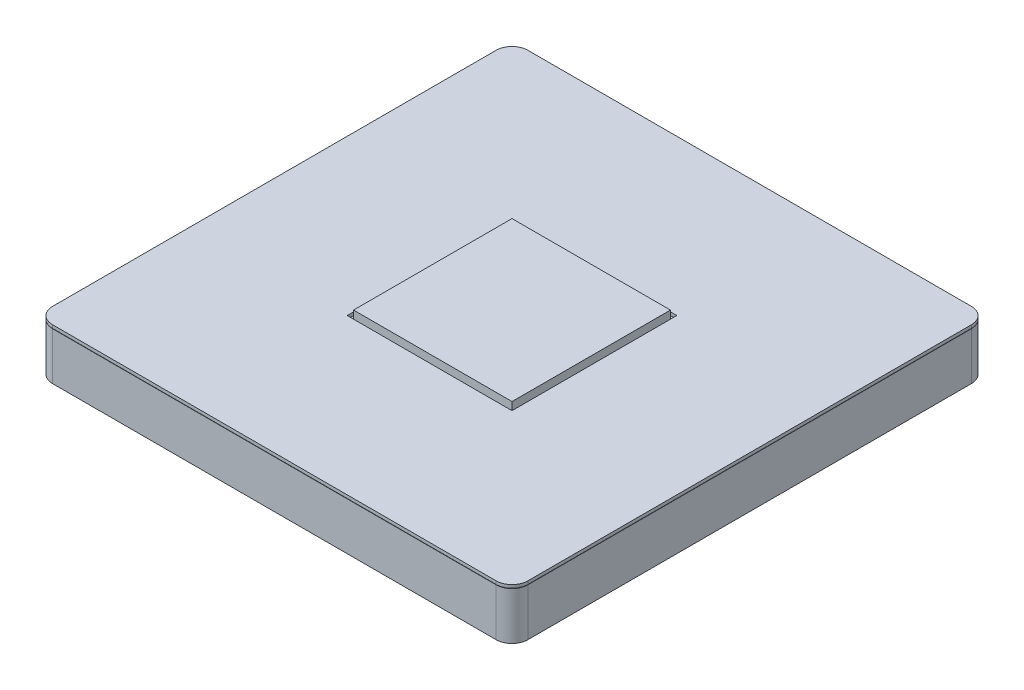
ISO-10303-21;
HEADER;
FILE_DESCRIPTION(('STEP AP214'),'2;1');
FILE_NAME('part.step','',(''),(''),'','','');
FILE_SCHEMA(('AUTOMOTIVE_DESIGN { 1 0 10303 214 1 1 1 1 }'));
ENDSEC;
DATA;
#1=APPLICATION_CONTEXT('core data for automotive mechanical design processes');
#2=APPLICATION_PROTOCOL_DEFINITION('international standard','automotive_design',2000,#1);
#3=PRODUCT_CONTEXT('',#1,'mechanical');
#4=PRODUCT('Part','Part','',(#3));
#5=PRODUCT_RELATED_PRODUCT_CATEGORY('part','',(#4));
#6=PRODUCT_DEFINITION_FORMATION('','',#4);
#7=PRODUCT_DEFINITION_CONTEXT('part definition',#1,'design');
#8=PRODUCT_DEFINITION('design','',#6,#7);
#9=PRODUCT_DEFINITION_SHAPE('','',#8);
#10=(LENGTH_UNIT() NAMED_UNIT(*) SI_UNIT(.MILLI.,.METRE.));
#11=(NAMED_UNIT(*) PLANE_ANGLE_UNIT() SI_UNIT($,.RADIAN.));
#12=(NAMED_UNIT(*) SI_UNIT($,.STERADIAN.) SOLID_ANGLE_UNIT());
#13=UNCERTAINTY_MEASURE_WITH_UNIT(LENGTH_MEASURE(1.E-05),#10,'distance_accuracy_value','');
#14=(GEOMETRIC_REPRESENTATION_CONTEXT(3) GLOBAL_UNCERTAINTY_ASSIGNED_CONTEXT((#13)) GLOBAL_UNIT_ASSIGNED_CONTEXT((#10,
#11,#12)) REPRESENTATION_CONTEXT('',''));
#15=CARTESIAN_POINT('',(0.,0.,0.));
#16=DIRECTION('',(0.,0.,1.));
#17=DIRECTION('',(1.,0.,0.));
#18=AXIS2_PLACEMENT_3D('',#15,#16,#17);
#19=CARTESIAN_POINT('',(2.50000000000001,1.76,2.5));
#20=DIRECTION('',(-1.,0.,0.));
#21=DIRECTION('',(0.,0.,1.));
#22=AXIS2_PLACEMENT_3D('',#19,#20,#21);
#23=PLANE('',#22);
#24=DIRECTION('',(0.,0.,-1.));
#25=VECTOR('',#24,1.);
#26=CARTESIAN_POINT('',(2.50000000000001,1.51,2.5));
#27=LINE('',#26,#25);
#28=CARTESIAN_POINT('',(2.50000000000001,1.51,2.5));
#29=VERTEX_POINT('',#28);
#30=CARTESIAN_POINT('',(2.50000000000001,1.51,-2.5));
#31=VERTEX_POINT('',#30);
#32=EDGE_CURVE('E108',#29,#31,#27,.T.);
#33=ORIENTED_EDGE('',*,*,#32,.T.);
#34=DIRECTION('',(0.,-1.,0.));
#35=VECTOR('',#34,1.);
#36=CARTESIAN_POINT('',(2.50000000000001,1.76,-2.5));
#37=LINE('',#36,#35);
#38=CARTESIAN_POINT('',(2.50000000000001,1.76,-2.5));
#39=VERTEX_POINT('',#38);
#40=EDGE_CURVE('E12',#39,#31,#37,.T.);
#41=ORIENTED_EDGE('',*,*,#40,.F.);
#42=DIRECTION('',(0.,0.,-1.));
#43=VECTOR('',#42,1.);
#44=CARTESIAN_POINT('',(2.50000000000001,1.76,2.5));
#45=LINE('',#44,#43);
#46=CARTESIAN_POINT('',(2.50000000000001,1.76,2.5));
#47=VERTEX_POINT('',#46);
#48=EDGE_CURVE('E96',#47,#39,#45,.T.);
#49=ORIENTED_EDGE('',*,*,#48,.F.);
#50=DIRECTION('',(0.,-1.,0.));
#51=VECTOR('',#50,1.);
#52=CARTESIAN_POINT('',(2.50000000000001,1.76,2.5));
#53=LINE('',#52,#51);
#54=EDGE_CURVE('E104',#47,#29,#53,.T.);
#55=ORIENTED_EDGE('',*,*,#54,.T.);
#56=EDGE_LOOP('',(#33,#41,#49,#55));
#57=FACE_BOUND('',#56,.T.);
#58=ADVANCED_FACE('F45',(#57),#23,.F.);
#59=CARTESIAN_POINT('',(-2.50000000000001,1.76,-2.5));
#60=DIRECTION('',(0.,0.,1.));
#61=DIRECTION('',(1.,0.,0.));
#62=AXIS2_PLACEMENT_3D('',#59,#60,#61);
#63=PLANE('',#62);
#64=DIRECTION('',(-1.,0.,0.));
#65=VECTOR('',#64,1.);
#66=CARTESIAN_POINT('',(-2.50000000000001,1.51,-2.5));
#67=LINE('',#66,#65);
#68=CARTESIAN_POINT('',(-2.50000000000001,1.51,-2.5));
#69=VERTEX_POINT('',#68);
#70=EDGE_CURVE('E100',#31,#69,#67,.T.);
#71=ORIENTED_EDGE('',*,*,#70,.T.);
#72=DIRECTION('',(0.,-1.,0.));
#73=VECTOR('',#72,1.);
#74=CARTESIAN_POINT('',(-2.50000000000001,1.76,-2.5));
#75=LINE('',#74,#73);
#76=CARTESIAN_POINT('',(-2.50000000000001,1.76,-2.5));
#77=VERTEX_POINT('',#76);
#78=EDGE_CURVE('E53',#77,#69,#75,.T.);
#79=ORIENTED_EDGE('',*,*,#78,.F.);
#80=DIRECTION('',(-1.,0.,0.));
#81=VECTOR('',#80,1.);
#82=CARTESIAN_POINT('',(-2.50000000000001,1.76,-2.5));
#83=LINE('',#82,#81);
#84=EDGE_CURVE('E91',#39,#77,#83,.T.);
#85=ORIENTED_EDGE('',*,*,#84,.F.);
#86=ORIENTED_EDGE('',*,*,#40,.T.);
#87=EDGE_LOOP('',(#71,#79,#85,#86));
#88=FACE_BOUND('',#87,.T.);
#89=ADVANCED_FACE('F99',(#88),#63,.F.);
#90=CARTESIAN_POINT('',(-2.50000000000001,1.76,2.5));
#91=DIRECTION('',(1.,0.,0.));
#92=DIRECTION('',(0.,0.,-1.));
#93=AXIS2_PLACEMENT_3D('',#90,#91,#92);
#94=PLANE('',#93);
#95=DIRECTION('',(0.,0.,1.));
#96=VECTOR('',#95,1.);
#97=CARTESIAN_POINT('',(-2.50000000000001,1.51,2.5));
#98=LINE('',#97,#96);
#99=CARTESIAN_POINT('',(-2.50000000000001,1.51,2.5));
#100=VERTEX_POINT('',#99);
#101=EDGE_CURVE('E78',#69,#100,#98,.T.);
#102=ORIENTED_EDGE('',*,*,#101,.T.);
#103=DIRECTION('',(0.,-1.,0.));
#104=VECTOR('',#103,1.);
#105=CARTESIAN_POINT('',(-2.50000000000001,1.76,2.5));
#106=LINE('',#105,#104);
#107=CARTESIAN_POINT('',(-2.50000000000001,1.76,2.5));
#108=VERTEX_POINT('',#107);
#109=EDGE_CURVE('E101',#108,#100,#106,.T.);
#110=ORIENTED_EDGE('',*,*,#109,.F.);
#111=DIRECTION('',(0.,0.,1.));
#112=VECTOR('',#111,1.);
#113=CARTESIAN_POINT('',(-2.50000000000001,1.76,2.5));
#114=LINE('',#113,#112);
#115=EDGE_CURVE('E94',#77,#108,#114,.T.);
#116=ORIENTED_EDGE('',*,*,#115,.F.);
#117=ORIENTED_EDGE('',*,*,#78,.T.);
#118=EDGE_LOOP('',(#102,#110,#116,#117));
#119=FACE_BOUND('',#118,.T.);
#120=ADVANCED_FACE('F102',(#119),#94,.F.);
#121=CARTESIAN_POINT('',(-2.50000000000001,1.76,2.5));
#122=DIRECTION('',(0.,0.,-1.));
#123=DIRECTION('',(-1.,0.,0.));
#124=AXIS2_PLACEMENT_3D('',#121,#122,#123);
#125=PLANE('',#124);
#126=DIRECTION('',(1.,0.,0.));
#127=VECTOR('',#126,1.);
#128=CARTESIAN_POINT('',(-2.50000000000001,1.51,2.5));
#129=LINE('',#128,#127);
#130=EDGE_CURVE('E84',#100,#29,#129,.T.);
#131=ORIENTED_EDGE('',*,*,#130,.T.);
#132=ORIENTED_EDGE('',*,*,#54,.F.);
#133=DIRECTION('',(1.,0.,0.));
#134=VECTOR('',#133,1.);
#135=CARTESIAN_POINT('',(-2.50000000000001,1.76,2.5));
#136=LINE('',#135,#134);
#137=EDGE_CURVE('E61',#108,#47,#136,.T.);
#138=ORIENTED_EDGE('',*,*,#137,.F.);
#139=ORIENTED_EDGE('',*,*,#109,.T.);
#140=EDGE_LOOP('',(#131,#132,#138,#139));
#141=FACE_BOUND('',#140,.T.);
#142=ADVANCED_FACE('F115',(#141),#125,.F.);
#143=CARTESIAN_POINT('',(0.,1.76,0.));
#144=DIRECTION('',(0.,-1.,0.));
#145=DIRECTION('',(0.,0.,-1.));
#146=AXIS2_PLACEMENT_3D('',#143,#144,#145);
#147=PLANE('',#146);
#148=ORIENTED_EDGE('',*,*,#48,.T.);
#149=ORIENTED_EDGE('',*,*,#84,.T.);
#150=ORIENTED_EDGE('',*,*,#115,.T.);
#151=ORIENTED_EDGE('',*,*,#137,.T.);
#152=EDGE_LOOP('',(#148,#149,#150,#151));
#153=FACE_BOUND('',#152,.T.);
#154=ADVANCED_FACE('F92',(#153),#147,.F.);
#155=CARTESIAN_POINT('',(0.,1.51,0.));
#156=DIRECTION('',(0.,-1.,0.));
#157=DIRECTION('',(0.,0.,-1.));
#158=AXIS2_PLACEMENT_3D('',#155,#156,#157);
#159=PLANE('',#158);
#160=ORIENTED_EDGE('',*,*,#32,.F.);
#161=ORIENTED_EDGE('',*,*,#130,.F.);
#162=ORIENTED_EDGE('',*,*,#101,.F.);
#163=ORIENTED_EDGE('',*,*,#70,.F.);
#164=EDGE_LOOP('',(#160,#161,#162,#163));
#165=FACE_BOUND('',#164,.T.);
#166=ADVANCED_FACE('F118',(#165),#159,.T.);
#167=CLOSED_SHELL('',(#58,#89,#120,#142,#154,#166));
#168=MANIFOLD_SOLID_BREP('B2',#167);
#169=CARTESIAN_POINT('',(-7.,1.61,-7.));
#170=DIRECTION('',(0.,1.,0.));
#171=DIRECTION('',(0.,0.,1.));
#172=AXIS2_PLACEMENT_3D('',#169,#170,#171);
#173=PLANE('',#172);
#174=CARTESIAN_POINT('',(-7.,1.61,-7.));
#175=DIRECTION('',(0.,1.,0.));
#176=DIRECTION('',(0.,0.,1.));
#177=AXIS2_PLACEMENT_3D('',#174,#175,#176);
#178=CIRCLE('',#177,0.5);
#179=CARTESIAN_POINT('',(-7.,1.61,-7.5));
#180=VERTEX_POINT('',#179);
#181=CARTESIAN_POINT('',(-7.5,1.61,-7.));
#182=VERTEX_POINT('',#181);
#183=EDGE_CURVE('E302',#180,#182,#178,.T.);
#184=ORIENTED_EDGE('',*,*,#183,.T.);
#185=DIRECTION('',(0.,0.,1.));
#186=VECTOR('',#185,1.);
#187=CARTESIAN_POINT('',(-7.5,1.61,-7.));
#188=LINE('',#187,#186);
#189=CARTESIAN_POINT('',(-7.5,1.61,7.));
#190=VERTEX_POINT('',#189);
#191=EDGE_CURVE('E305',#182,#190,#188,.T.);
#192=ORIENTED_EDGE('',*,*,#191,.T.);
#193=CARTESIAN_POINT('',(-7.,1.61,7.));
#194=DIRECTION('',(0.,1.,0.));
#195=DIRECTION('',(0.,0.,1.));
#196=AXIS2_PLACEMENT_3D('',#193,#194,#195);
#197=CIRCLE('',#196,0.5);
#198=CARTESIAN_POINT('',(-7.,1.61,7.5));
#199=VERTEX_POINT('',#198);
#200=EDGE_CURVE('E308',#190,#199,#197,.T.);
#201=ORIENTED_EDGE('',*,*,#200,.T.);
#202=DIRECTION('',(1.,0.,0.));
#203=VECTOR('',#202,1.);
#204=CARTESIAN_POINT('',(-7.,1.61,7.5));
#205=LINE('',#204,#203);
#206=CARTESIAN_POINT('',(7.,1.61,7.5));
#207=VERTEX_POINT('',#206);
#208=EDGE_CURVE('E310',#199,#207,#205,.T.);
#209=ORIENTED_EDGE('',*,*,#208,.T.);
#210=CARTESIAN_POINT('',(7.,1.61,7.));
#211=DIRECTION('',(0.,1.,0.));
#212=DIRECTION('',(0.,0.,1.));
#213=AXIS2_PLACEMENT_3D('',#210,#211,#212);
#214=CIRCLE('',#213,0.5);
#215=CARTESIAN_POINT('',(7.5,1.61,7.));
#216=VERTEX_POINT('',#215);
#217=EDGE_CURVE('E312',#207,#216,#214,.T.);
#218=ORIENTED_EDGE('',*,*,#217,.T.);
#219=DIRECTION('',(0.,0.,-1.));
#220=VECTOR('',#219,1.);
#221=CARTESIAN_POINT('',(7.5,1.61,7.));
#222=LINE('',#221,#220);
#223=CARTESIAN_POINT('',(7.5,1.61,-7.));
#224=VERTEX_POINT('',#223);
#225=EDGE_CURVE('E314',#216,#224,#222,.T.);
#226=ORIENTED_EDGE('',*,*,#225,.T.);
#227=CARTESIAN_POINT('',(7.,1.61,-7.));
#228=DIRECTION('',(0.,1.,0.));
#229=DIRECTION('',(0.,0.,1.));
#230=AXIS2_PLACEMENT_3D('',#227,#228,#229);
#231=CIRCLE('',#230,0.5);
#232=CARTESIAN_POINT('',(7.,1.61,-7.5));
#233=VERTEX_POINT('',#232);
#234=EDGE_CURVE('E316',#224,#233,#231,.T.);
#235=ORIENTED_EDGE('',*,*,#234,.T.);
#236=DIRECTION('',(-1.,0.,0.));
#237=VECTOR('',#236,1.);
#238=CARTESIAN_POINT('',(7.,1.61,-7.5));
#239=LINE('',#238,#237);
#240=EDGE_CURVE('E318',#233,#180,#239,.T.);
#241=ORIENTED_EDGE('',*,*,#240,.T.);
#242=EDGE_LOOP('',(#184,#192,#201,#209,#218,#226,#235,#241));
#243=FACE_BOUND('',#242,.T.);
#244=DIRECTION('',(-1.,0.,0.));
#245=VECTOR('',#244,1.);
#246=CARTESIAN_POINT('',(-2.6,1.61,-2.60000000000001));
#247=LINE('',#246,#245);
#248=CARTESIAN_POINT('',(2.6,1.61,-2.60000000000001));
#249=VERTEX_POINT('',#248);
#250=CARTESIAN_POINT('',(-2.6,1.61,-2.60000000000001));
#251=VERTEX_POINT('',#250);
#252=EDGE_CURVE('E274',#249,#251,#247,.T.);
#253=ORIENTED_EDGE('',*,*,#252,.F.);
#254=DIRECTION('',(0.,0.,-1.));
#255=VECTOR('',#254,1.);
#256=CARTESIAN_POINT('',(2.6,1.61,2.60000000000001));
#257=LINE('',#256,#255);
#258=CARTESIAN_POINT('',(2.6,1.61,2.60000000000001));
#259=VERTEX_POINT('',#258);
#260=EDGE_CURVE('E266',#259,#249,#257,.T.);
#261=ORIENTED_EDGE('',*,*,#260,.F.);
#262=DIRECTION('',(1.,0.,0.));
#263=VECTOR('',#262,1.);
#264=CARTESIAN_POINT('',(-2.6,1.61,2.60000000000001));
#265=LINE('',#264,#263);
#266=CARTESIAN_POINT('',(-2.6,1.61,2.60000000000001));
#267=VERTEX_POINT('',#266);
#268=EDGE_CURVE('E288',#267,#259,#265,.T.);
#269=ORIENTED_EDGE('',*,*,#268,.F.);
#270=DIRECTION('',(0.,0.,1.));
#271=VECTOR('',#270,1.);
#272=CARTESIAN_POINT('',(-2.6,1.61,2.60000000000001));
#273=LINE('',#272,#271);
#274=EDGE_CURVE('E286',#251,#267,#273,.T.);
#275=ORIENTED_EDGE('',*,*,#274,.F.);
#276=EDGE_LOOP('',(#253,#261,#269,#275));
#277=FACE_BOUND('',#276,.T.);
#278=ADVANCED_FACE('F177',(#243,#277),#173,.T.);
#279=CARTESIAN_POINT('',(-7.,1.51,-7.));
#280=DIRECTION('',(0.,1.,0.));
#281=DIRECTION('',(0.,0.,1.));
#282=AXIS2_PLACEMENT_3D('',#279,#280,#281);
#283=PLANE('',#282);
#284=CARTESIAN_POINT('',(-7.,1.51,-7.));
#285=DIRECTION('',(0.,1.,0.));
#286=DIRECTION('',(0.,0.,1.));
#287=AXIS2_PLACEMENT_3D('',#284,#285,#286);
#288=CIRCLE('',#287,0.5);
#289=CARTESIAN_POINT('',(-7.,1.51,-7.5));
#290=VERTEX_POINT('',#289);
#291=CARTESIAN_POINT('',(-7.5,1.51,-7.));
#292=VERTEX_POINT('',#291);
#293=EDGE_CURVE('E282',#290,#292,#288,.T.);
#294=ORIENTED_EDGE('',*,*,#293,.F.);
#295=DIRECTION('',(-1.,0.,0.));
#296=VECTOR('',#295,1.);
#297=CARTESIAN_POINT('',(7.,1.51,-7.5));
#298=LINE('',#297,#296);
#299=CARTESIAN_POINT('',(7.,1.51,-7.5));
#300=VERTEX_POINT('',#299);
#301=EDGE_CURVE('E306',#300,#290,#298,.T.);
#302=ORIENTED_EDGE('',*,*,#301,.F.);
#303=CARTESIAN_POINT('',(7.,1.51,-7.));
#304=DIRECTION('',(0.,1.,0.));
#305=DIRECTION('',(0.,0.,1.));
#306=AXIS2_PLACEMENT_3D('',#303,#304,#305);
#307=CIRCLE('',#306,0.5);
#308=CARTESIAN_POINT('',(7.5,1.51,-7.));
#309=VERTEX_POINT('',#308);
#310=EDGE_CURVE('E333',#309,#300,#307,.T.);
#311=ORIENTED_EDGE('',*,*,#310,.F.);
#312=DIRECTION('',(0.,0.,-1.));
#313=VECTOR('',#312,1.);
#314=CARTESIAN_POINT('',(7.5,1.51,7.));
#315=LINE('',#314,#313);
#316=CARTESIAN_POINT('',(7.5,1.51,7.));
#317=VERTEX_POINT('',#316);
#318=EDGE_CURVE('E331',#317,#309,#315,.T.);
#319=ORIENTED_EDGE('',*,*,#318,.F.);
#320=CARTESIAN_POINT('',(7.,1.51,7.));
#321=DIRECTION('',(0.,1.,0.));
#322=DIRECTION('',(0.,0.,1.));
#323=AXIS2_PLACEMENT_3D('',#320,#321,#322);
#324=CIRCLE('',#323,0.5);
#325=CARTESIAN_POINT('',(7.,1.51,7.5));
#326=VERTEX_POINT('',#325);
#327=EDGE_CURVE('E329',#326,#317,#324,.T.);
#328=ORIENTED_EDGE('',*,*,#327,.F.);
#329=DIRECTION('',(1.,0.,0.));
#330=VECTOR('',#329,1.);
#331=CARTESIAN_POINT('',(-7.,1.51,7.5));
#332=LINE('',#331,#330);
#333=CARTESIAN_POINT('',(-7.,1.51,7.5));
#334=VERTEX_POINT('',#333);
#335=EDGE_CURVE('E327',#334,#326,#332,.T.);
#336=ORIENTED_EDGE('',*,*,#335,.F.);
#337=CARTESIAN_POINT('',(-7.,1.51,7.));
#338=DIRECTION('',(0.,1.,0.));
#339=DIRECTION('',(0.,0.,1.));
#340=AXIS2_PLACEMENT_3D('',#337,#338,#339);
#341=CIRCLE('',#340,0.5);
#342=CARTESIAN_POINT('',(-7.5,1.51,7.));
#343=VERTEX_POINT('',#342);
#344=EDGE_CURVE('E325',#343,#334,#341,.T.);
#345=ORIENTED_EDGE('',*,*,#344,.F.);
#346=DIRECTION('',(0.,0.,1.));
#347=VECTOR('',#346,1.);
#348=CARTESIAN_POINT('',(-7.5,1.51,-7.));
#349=LINE('',#348,#347);
#350=EDGE_CURVE('E323',#292,#343,#349,.T.);
#351=ORIENTED_EDGE('',*,*,#350,.F.);
#352=EDGE_LOOP('',(#294,#302,#311,#319,#328,#336,#345,#351));
#353=FACE_BOUND('',#352,.T.);
#354=DIRECTION('',(0.,0.,-1.));
#355=VECTOR('',#354,1.);
#356=CARTESIAN_POINT('',(2.6,1.51,2.60000000000001));
#357=LINE('',#356,#355);
#358=CARTESIAN_POINT('',(2.6,1.51,2.60000000000001));
#359=VERTEX_POINT('',#358);
#360=CARTESIAN_POINT('',(2.6,1.51,-2.60000000000001));
#361=VERTEX_POINT('',#360);
#362=EDGE_CURVE('E200',#359,#361,#357,.T.);
#363=ORIENTED_EDGE('',*,*,#362,.T.);
#364=DIRECTION('',(-1.,0.,0.));
#365=VECTOR('',#364,1.);
#366=CARTESIAN_POINT('',(-2.6,1.51,-2.60000000000001));
#367=LINE('',#366,#365);
#368=CARTESIAN_POINT('',(-2.6,1.51,-2.60000000000001));
#369=VERTEX_POINT('',#368);
#370=EDGE_CURVE('E281',#361,#369,#367,.T.);
#371=ORIENTED_EDGE('',*,*,#370,.T.);
#372=DIRECTION('',(0.,0.,1.));
#373=VECTOR('',#372,1.);
#374=CARTESIAN_POINT('',(-2.6,1.51,2.60000000000001));
#375=LINE('',#374,#373);
#376=CARTESIAN_POINT('',(-2.6,1.51,2.60000000000001));
#377=VERTEX_POINT('',#376);
#378=EDGE_CURVE('E294',#369,#377,#375,.T.);
#379=ORIENTED_EDGE('',*,*,#378,.T.);
#380=DIRECTION('',(1.,0.,0.));
#381=VECTOR('',#380,1.);
#382=CARTESIAN_POINT('',(-2.6,1.51,2.60000000000001));
#383=LINE('',#382,#381);
#384=EDGE_CURVE('E275',#377,#359,#383,.T.);
#385=ORIENTED_EDGE('',*,*,#384,.T.);
#386=EDGE_LOOP('',(#363,#371,#379,#385));
#387=FACE_BOUND('',#386,.T.);
#388=ADVANCED_FACE('F363',(#353,#387),#283,.F.);
#389=CARTESIAN_POINT('',(-7.,1.61,-7.));
#390=DIRECTION('',(0.,-1.,0.));
#391=DIRECTION('',(0.,0.,-1.));
#392=AXIS2_PLACEMENT_3D('',#389,#390,#391);
#393=CYLINDRICAL_SURFACE('',#392,0.5);
#394=ORIENTED_EDGE('',*,*,#293,.T.);
#395=DIRECTION('',(0.,-1.,0.));
#396=VECTOR('',#395,1.);
#397=CARTESIAN_POINT('',(-7.5,1.61,-7.));
#398=LINE('',#397,#396);
#399=EDGE_CURVE('E43',#182,#292,#398,.T.);
#400=ORIENTED_EDGE('',*,*,#399,.F.);
#401=ORIENTED_EDGE('',*,*,#183,.F.);
#402=DIRECTION('',(0.,-1.,0.));
#403=VECTOR('',#402,1.);
#404=CARTESIAN_POINT('',(-7.,1.61,-7.5));
#405=LINE('',#404,#403);
#406=EDGE_CURVE('E320',#180,#290,#405,.T.);
#407=ORIENTED_EDGE('',*,*,#406,.T.);
#408=EDGE_LOOP('',(#394,#400,#401,#407));
#409=FACE_BOUND('',#408,.T.);
#410=ADVANCED_FACE('F179',(#409),#393,.T.);
#411=CARTESIAN_POINT('',(-7.5,1.61,-7.));
#412=DIRECTION('',(1.,0.,0.));
#413=DIRECTION('',(0.,0.,-1.));
#414=AXIS2_PLACEMENT_3D('',#411,#412,#413);
#415=PLANE('',#414);
#416=ORIENTED_EDGE('',*,*,#350,.T.);
#417=DIRECTION('',(0.,-1.,0.));
#418=VECTOR('',#417,1.);
#419=CARTESIAN_POINT('',(-7.5,1.61,7.));
#420=LINE('',#419,#418);
#421=EDGE_CURVE('E185',#190,#343,#420,.T.);
#422=ORIENTED_EDGE('',*,*,#421,.F.);
#423=ORIENTED_EDGE('',*,*,#191,.F.);
#424=ORIENTED_EDGE('',*,*,#399,.T.);
#425=EDGE_LOOP('',(#416,#422,#423,#424));
#426=FACE_BOUND('',#425,.T.);
#427=ADVANCED_FACE('F380',(#426),#415,.F.);
#428=CARTESIAN_POINT('',(-7.,1.61,7.));
#429=DIRECTION('',(0.,-1.,0.));
#430=DIRECTION('',(0.,0.,-1.));
#431=AXIS2_PLACEMENT_3D('',#428,#429,#430);
#432=CYLINDRICAL_SURFACE('',#431,0.5);
#433=ORIENTED_EDGE('',*,*,#344,.T.);
#434=DIRECTION('',(0.,-1.,0.));
#435=VECTOR('',#434,1.);
#436=CARTESIAN_POINT('',(-7.,1.61,7.5));
#437=LINE('',#436,#435);
#438=EDGE_CURVE('E350',#199,#334,#437,.T.);
#439=ORIENTED_EDGE('',*,*,#438,.F.);
#440=ORIENTED_EDGE('',*,*,#200,.F.);
#441=ORIENTED_EDGE('',*,*,#421,.T.);
#442=EDGE_LOOP('',(#433,#439,#440,#441));
#443=FACE_BOUND('',#442,.T.);
#444=ADVANCED_FACE('F357',(#443),#432,.T.);
#445=CARTESIAN_POINT('',(-7.,1.61,7.5));
#446=DIRECTION('',(0.,0.,-1.));
#447=DIRECTION('',(-1.,0.,0.));
#448=AXIS2_PLACEMENT_3D('',#445,#446,#447);
#449=PLANE('',#448);
#450=ORIENTED_EDGE('',*,*,#335,.T.);
#451=DIRECTION('',(0.,-1.,0.));
#452=VECTOR('',#451,1.);
#453=CARTESIAN_POINT('',(7.,1.61,7.5));
#454=LINE('',#453,#452);
#455=EDGE_CURVE('E347',#207,#326,#454,.T.);
#456=ORIENTED_EDGE('',*,*,#455,.F.);
#457=ORIENTED_EDGE('',*,*,#208,.F.);
#458=ORIENTED_EDGE('',*,*,#438,.T.);
#459=EDGE_LOOP('',(#450,#456,#457,#458));
#460=FACE_BOUND('',#459,.T.);
#461=ADVANCED_FACE('F369',(#460),#449,.F.);
#462=CARTESIAN_POINT('',(7.,1.61,7.));
#463=DIRECTION('',(0.,-1.,0.));
#464=DIRECTION('',(0.,0.,-1.));
#465=AXIS2_PLACEMENT_3D('',#462,#463,#464);
#466=CYLINDRICAL_SURFACE('',#465,0.5);
#467=ORIENTED_EDGE('',*,*,#327,.T.);
#468=DIRECTION('',(0.,-1.,0.));
#469=VECTOR('',#468,1.);
#470=CARTESIAN_POINT('',(7.5,1.61,7.));
#471=LINE('',#470,#469);
#472=EDGE_CURVE('E344',#216,#317,#471,.T.);
#473=ORIENTED_EDGE('',*,*,#472,.F.);
#474=ORIENTED_EDGE('',*,*,#217,.F.);
#475=ORIENTED_EDGE('',*,*,#455,.T.);
#476=EDGE_LOOP('',(#467,#473,#474,#475));
#477=FACE_BOUND('',#476,.T.);
#478=ADVANCED_FACE('F373',(#477),#466,.T.);
#479=CARTESIAN_POINT('',(7.5,1.61,7.));
#480=DIRECTION('',(-1.,0.,0.));
#481=DIRECTION('',(0.,0.,1.));
#482=AXIS2_PLACEMENT_3D('',#479,#480,#481);
#483=PLANE('',#482);
#484=ORIENTED_EDGE('',*,*,#318,.T.);
#485=DIRECTION('',(0.,-1.,0.));
#486=VECTOR('',#485,1.);
#487=CARTESIAN_POINT('',(7.5,1.61,-7.));
#488=LINE('',#487,#486);
#489=EDGE_CURVE('E341',#224,#309,#488,.T.);
#490=ORIENTED_EDGE('',*,*,#489,.F.);
#491=ORIENTED_EDGE('',*,*,#225,.F.);
#492=ORIENTED_EDGE('',*,*,#472,.T.);
#493=EDGE_LOOP('',(#484,#490,#491,#492));
#494=FACE_BOUND('',#493,.T.);
#495=ADVANCED_FACE('F393',(#494),#483,.F.);
#496=CARTESIAN_POINT('',(7.,1.61,-7.));
#497=DIRECTION('',(0.,-1.,0.));
#498=DIRECTION('',(0.,0.,-1.));
#499=AXIS2_PLACEMENT_3D('',#496,#497,#498);
#500=CYLINDRICAL_SURFACE('',#499,0.5);
#501=ORIENTED_EDGE('',*,*,#310,.T.);
#502=DIRECTION('',(0.,-1.,0.));
#503=VECTOR('',#502,1.);
#504=CARTESIAN_POINT('',(7.,1.61,-7.5));
#505=LINE('',#504,#503);
#506=EDGE_CURVE('E338',#233,#300,#505,.T.);
#507=ORIENTED_EDGE('',*,*,#506,.F.);
#508=ORIENTED_EDGE('',*,*,#234,.F.);
#509=ORIENTED_EDGE('',*,*,#489,.T.);
#510=EDGE_LOOP('',(#501,#507,#508,#509));
#511=FACE_BOUND('',#510,.T.);
#512=ADVANCED_FACE('F391',(#511),#500,.T.);
#513=CARTESIAN_POINT('',(7.,1.61,-7.5));
#514=DIRECTION('',(0.,0.,1.));
#515=DIRECTION('',(1.,0.,0.));
#516=AXIS2_PLACEMENT_3D('',#513,#514,#515);
#517=PLANE('',#516);
#518=ORIENTED_EDGE('',*,*,#301,.T.);
#519=ORIENTED_EDGE('',*,*,#406,.F.);
#520=ORIENTED_EDGE('',*,*,#240,.F.);
#521=ORIENTED_EDGE('',*,*,#506,.T.);
#522=EDGE_LOOP('',(#518,#519,#520,#521));
#523=FACE_BOUND('',#522,.T.);
#524=ADVANCED_FACE('F386',(#523),#517,.F.);
#525=CARTESIAN_POINT('',(2.6,1.61,2.60000000000001));
#526=DIRECTION('',(-1.,0.,0.));
#527=DIRECTION('',(0.,0.,1.));
#528=AXIS2_PLACEMENT_3D('',#525,#526,#527);
#529=PLANE('',#528);
#530=ORIENTED_EDGE('',*,*,#362,.F.);
#531=DIRECTION('',(0.,-1.,0.));
#532=VECTOR('',#531,1.);
#533=CARTESIAN_POINT('',(2.6,1.61,2.60000000000001));
#534=LINE('',#533,#532);
#535=EDGE_CURVE('E270',#259,#359,#534,.T.);
#536=ORIENTED_EDGE('',*,*,#535,.F.);
#537=ORIENTED_EDGE('',*,*,#260,.T.);
#538=DIRECTION('',(0.,-1.,0.));
#539=VECTOR('',#538,1.);
#540=CARTESIAN_POINT('',(2.6,1.61,-2.60000000000001));
#541=LINE('',#540,#539);
#542=EDGE_CURVE('E269',#249,#361,#541,.T.);
#543=ORIENTED_EDGE('',*,*,#542,.T.);
#544=EDGE_LOOP('',(#530,#536,#537,#543));
#545=FACE_BOUND('',#544,.T.);
#546=ADVANCED_FACE('F268',(#545),#529,.T.);
#547=CARTESIAN_POINT('',(-2.6,1.61,-2.60000000000001));
#548=DIRECTION('',(0.,0.,1.));
#549=DIRECTION('',(1.,0.,0.));
#550=AXIS2_PLACEMENT_3D('',#547,#548,#549);
#551=PLANE('',#550);
#552=ORIENTED_EDGE('',*,*,#370,.F.);
#553=ORIENTED_EDGE('',*,*,#542,.F.);
#554=ORIENTED_EDGE('',*,*,#252,.T.);
#555=DIRECTION('',(0.,-1.,0.));
#556=VECTOR('',#555,1.);
#557=CARTESIAN_POINT('',(-2.6,1.61,-2.60000000000001));
#558=LINE('',#557,#556);
#559=EDGE_CURVE('E283',#251,#369,#558,.T.);
#560=ORIENTED_EDGE('',*,*,#559,.T.);
#561=EDGE_LOOP('',(#552,#553,#554,#560));
#562=FACE_BOUND('',#561,.T.);
#563=ADVANCED_FACE('F278',(#562),#551,.T.);
#564=CARTESIAN_POINT('',(-2.6,1.61,2.60000000000001));
#565=DIRECTION('',(1.,0.,0.));
#566=DIRECTION('',(0.,0.,-1.));
#567=AXIS2_PLACEMENT_3D('',#564,#565,#566);
#568=PLANE('',#567);
#569=ORIENTED_EDGE('',*,*,#378,.F.);
#570=ORIENTED_EDGE('',*,*,#559,.F.);
#571=ORIENTED_EDGE('',*,*,#274,.T.);
#572=DIRECTION('',(0.,-1.,0.));
#573=VECTOR('',#572,1.);
#574=CARTESIAN_POINT('',(-2.6,1.61,2.60000000000001));
#575=LINE('',#574,#573);
#576=EDGE_CURVE('E192',#267,#377,#575,.T.);
#577=ORIENTED_EDGE('',*,*,#576,.T.);
#578=EDGE_LOOP('',(#569,#570,#571,#577));
#579=FACE_BOUND('',#578,.T.);
#580=ADVANCED_FACE('F418',(#579),#568,.T.);
#581=CARTESIAN_POINT('',(-2.6,1.61,2.60000000000001));
#582=DIRECTION('',(0.,0.,-1.));
#583=DIRECTION('',(-1.,0.,0.));
#584=AXIS2_PLACEMENT_3D('',#581,#582,#583);
#585=PLANE('',#584);
#586=ORIENTED_EDGE('',*,*,#384,.F.);
#587=ORIENTED_EDGE('',*,*,#576,.F.);
#588=ORIENTED_EDGE('',*,*,#268,.T.);
#589=ORIENTED_EDGE('',*,*,#535,.T.);
#590=EDGE_LOOP('',(#586,#587,#588,#589));
#591=FACE_BOUND('',#590,.T.);
#592=ADVANCED_FACE('F422',(#591),#585,.T.);
#593=CLOSED_SHELL('',(#278,#388,#410,#427,#444,#461,#478,#495,#512,#524,#546,#563,#580,#592));
#594=MANIFOLD_SOLID_BREP('B6',#593);
#595=CARTESIAN_POINT('',(7.5,1.5,7.5));
#596=DIRECTION('',(-1.,0.,0.));
#597=DIRECTION('',(0.,0.,1.));
#598=AXIS2_PLACEMENT_3D('',#595,#596,#597);
#599=PLANE('',#598);
#600=DIRECTION('',(0.,0.,-1.));
#601=VECTOR('',#600,1.);
#602=CARTESIAN_POINT('',(7.5,0.,7.5));
#603=LINE('',#602,#601);
#604=CARTESIAN_POINT('',(7.5,0.,7.));
#605=VERTEX_POINT('',#604);
#606=CARTESIAN_POINT('',(7.5,0.,-7.));
#607=VERTEX_POINT('',#606);
#608=EDGE_CURVE('E634',#605,#607,#603,.T.);
#609=ORIENTED_EDGE('',*,*,#608,.T.);
#610=DIRECTION('',(0.,-1.,0.));
#611=VECTOR('',#610,1.);
#612=CARTESIAN_POINT('',(7.5,1.5,-7.));
#613=LINE('',#612,#611);
#614=CARTESIAN_POINT('',(7.5,1.5,-7.));
#615=VERTEX_POINT('',#614);
#616=EDGE_CURVE('E175',#607,#615,#613,.F.);
#617=ORIENTED_EDGE('',*,*,#616,.T.);
#618=DIRECTION('',(0.,0.,-1.));
#619=VECTOR('',#618,1.);
#620=CARTESIAN_POINT('',(7.5,1.5,7.5));
#621=LINE('',#620,#619);
#622=CARTESIAN_POINT('',(7.5,1.5,7.));
#623=VERTEX_POINT('',#622);
#624=EDGE_CURVE('E602',#623,#615,#621,.T.);
#625=ORIENTED_EDGE('',*,*,#624,.F.);
#626=DIRECTION('',(0.,-1.,0.));
#627=VECTOR('',#626,1.);
#628=CARTESIAN_POINT('',(7.5,1.5,7.));
#629=LINE('',#628,#627);
#630=EDGE_CURVE('E518',#623,#605,#629,.T.);
#631=ORIENTED_EDGE('',*,*,#630,.T.);
#632=EDGE_LOOP('',(#609,#617,#625,#631));
#633=FACE_BOUND('',#632,.T.);
#634=ADVANCED_FACE('F510',(#633),#599,.F.);
#635=CARTESIAN_POINT('',(-7.5,1.5,-7.5));
#636=DIRECTION('',(0.,0.,1.));
#637=DIRECTION('',(1.,0.,0.));
#638=AXIS2_PLACEMENT_3D('',#635,#636,#637);
#639=PLANE('',#638);
#640=DIRECTION('',(-1.,0.,0.));
#641=VECTOR('',#640,1.);
#642=CARTESIAN_POINT('',(-7.5,0.,-7.5));
#643=LINE('',#642,#641);
#644=CARTESIAN_POINT('',(7.,0.,-7.5));
#645=VERTEX_POINT('',#644);
#646=CARTESIAN_POINT('',(-7.,0.,-7.5));
#647=VERTEX_POINT('',#646);
#648=EDGE_CURVE('E607',#645,#647,#643,.T.);
#649=ORIENTED_EDGE('',*,*,#648,.T.);
#650=DIRECTION('',(0.,-1.,0.));
#651=VECTOR('',#650,1.);
#652=CARTESIAN_POINT('',(-7.,1.5,-7.5));
#653=LINE('',#652,#651);
#654=CARTESIAN_POINT('',(-7.,1.5,-7.5));
#655=VERTEX_POINT('',#654);
#656=EDGE_CURVE('E525',#647,#655,#653,.F.);
#657=ORIENTED_EDGE('',*,*,#656,.T.);
#658=DIRECTION('',(-1.,0.,0.));
#659=VECTOR('',#658,1.);
#660=CARTESIAN_POINT('',(-7.5,1.5,-7.5));
#661=LINE('',#660,#659);
#662=CARTESIAN_POINT('',(7.,1.5,-7.5));
#663=VERTEX_POINT('',#662);
#664=EDGE_CURVE('E605',#663,#655,#661,.T.);
#665=ORIENTED_EDGE('',*,*,#664,.F.);
#666=DIRECTION('',(0.,-1.,0.));
#667=VECTOR('',#666,1.);
#668=CARTESIAN_POINT('',(7.,1.5,-7.5));
#669=LINE('',#668,#667);
#670=EDGE_CURVE('E626',#663,#645,#669,.T.);
#671=ORIENTED_EDGE('',*,*,#670,.T.);
#672=EDGE_LOOP('',(#649,#657,#665,#671));
#673=FACE_BOUND('',#672,.T.);
#674=ADVANCED_FACE('F654',(#673),#639,.F.);
#675=CARTESIAN_POINT('',(-7.5,1.5,7.5));
#676=DIRECTION('',(1.,0.,0.));
#677=DIRECTION('',(0.,0.,-1.));
#678=AXIS2_PLACEMENT_3D('',#675,#676,#677);
#679=PLANE('',#678);
#680=DIRECTION('',(0.,0.,1.));
#681=VECTOR('',#680,1.);
#682=CARTESIAN_POINT('',(-7.5,0.,7.5));
#683=LINE('',#682,#681);
#684=CARTESIAN_POINT('',(-7.5,0.,-7.));
#685=VERTEX_POINT('',#684);
#686=CARTESIAN_POINT('',(-7.5,0.,7.));
#687=VERTEX_POINT('',#686);
#688=EDGE_CURVE('E603',#685,#687,#683,.T.);
#689=ORIENTED_EDGE('',*,*,#688,.T.);
#690=DIRECTION('',(0.,-1.,0.));
#691=VECTOR('',#690,1.);
#692=CARTESIAN_POINT('',(-7.5,1.5,7.));
#693=LINE('',#692,#691);
#694=CARTESIAN_POINT('',(-7.5,1.5,7.));
#695=VERTEX_POINT('',#694);
#696=EDGE_CURVE('E581',#687,#695,#693,.F.);
#697=ORIENTED_EDGE('',*,*,#696,.T.);
#698=DIRECTION('',(0.,0.,1.));
#699=VECTOR('',#698,1.);
#700=CARTESIAN_POINT('',(-7.5,1.5,7.5));
#701=LINE('',#700,#699);
#702=CARTESIAN_POINT('',(-7.5,1.5,-7.));
#703=VERTEX_POINT('',#702);
#704=EDGE_CURVE('E642',#703,#695,#701,.T.);
#705=ORIENTED_EDGE('',*,*,#704,.F.);
#706=DIRECTION('',(0.,-1.,0.));
#707=VECTOR('',#706,1.);
#708=CARTESIAN_POINT('',(-7.5,1.5,-7.));
#709=LINE('',#708,#707);
#710=EDGE_CURVE('E586',#703,#685,#709,.T.);
#711=ORIENTED_EDGE('',*,*,#710,.T.);
#712=EDGE_LOOP('',(#689,#697,#705,#711));
#713=FACE_BOUND('',#712,.T.);
#714=ADVANCED_FACE('F653',(#713),#679,.F.);
#715=CARTESIAN_POINT('',(-7.5,1.5,7.5));
#716=DIRECTION('',(0.,0.,-1.));
#717=DIRECTION('',(-1.,0.,0.));
#718=AXIS2_PLACEMENT_3D('',#715,#716,#717);
#719=PLANE('',#718);
#720=DIRECTION('',(1.,0.,0.));
#721=VECTOR('',#720,1.);
#722=CARTESIAN_POINT('',(-7.5,1.5,7.5));
#723=LINE('',#722,#721);
#724=CARTESIAN_POINT('',(-7.,1.5,7.5));
#725=VERTEX_POINT('',#724);
#726=CARTESIAN_POINT('',(7.,1.5,7.5));
#727=VERTEX_POINT('',#726);
#728=EDGE_CURVE('E596',#725,#727,#723,.T.);
#729=ORIENTED_EDGE('',*,*,#728,.F.);
#730=DIRECTION('',(0.,-1.,0.));
#731=VECTOR('',#730,1.);
#732=CARTESIAN_POINT('',(-7.,1.5,7.5));
#733=LINE('',#732,#731);
#734=CARTESIAN_POINT('',(-7.,0.,7.5));
#735=VERTEX_POINT('',#734);
#736=EDGE_CURVE('E580',#725,#735,#733,.T.);
#737=ORIENTED_EDGE('',*,*,#736,.T.);
#738=DIRECTION('',(1.,0.,0.));
#739=VECTOR('',#738,1.);
#740=CARTESIAN_POINT('',(-7.5,0.,7.5));
#741=LINE('',#740,#739);
#742=CARTESIAN_POINT('',(7.,0.,7.5));
#743=VERTEX_POINT('',#742);
#744=EDGE_CURVE('E593',#735,#743,#741,.T.);
#745=ORIENTED_EDGE('',*,*,#744,.T.);
#746=DIRECTION('',(0.,-1.,0.));
#747=VECTOR('',#746,1.);
#748=CARTESIAN_POINT('',(7.,1.5,7.5));
#749=LINE('',#748,#747);
#750=EDGE_CURVE('E598',#743,#727,#749,.F.);
#751=ORIENTED_EDGE('',*,*,#750,.T.);
#752=EDGE_LOOP('',(#729,#737,#745,#751));
#753=FACE_BOUND('',#752,.T.);
#754=ADVANCED_FACE('F592',(#753),#719,.F.);
#755=CARTESIAN_POINT('',(0.,1.5,0.));
#756=DIRECTION('',(0.,-1.,0.));
#757=DIRECTION('',(0.,0.,-1.));
#758=AXIS2_PLACEMENT_3D('',#755,#756,#757);
#759=PLANE('',#758);
#760=ORIENTED_EDGE('',*,*,#704,.T.);
#761=CARTESIAN_POINT('',(-7.,1.5,7.));
#762=DIRECTION('',(0.,-1.,0.));
#763=DIRECTION('',(0.,0.,-1.));
#764=AXIS2_PLACEMENT_3D('',#761,#762,#763);
#765=CIRCLE('',#764,0.5);
#766=EDGE_CURVE('E624',#695,#725,#765,.F.);
#767=ORIENTED_EDGE('',*,*,#766,.T.);
#768=ORIENTED_EDGE('',*,*,#728,.T.);
#769=CARTESIAN_POINT('',(7.,1.5,7.));
#770=DIRECTION('',(0.,-1.,0.));
#771=DIRECTION('',(0.,0.,-1.));
#772=AXIS2_PLACEMENT_3D('',#769,#770,#771);
#773=CIRCLE('',#772,0.5);
#774=EDGE_CURVE('E619',#727,#623,#773,.F.);
#775=ORIENTED_EDGE('',*,*,#774,.T.);
#776=ORIENTED_EDGE('',*,*,#624,.T.);
#777=CARTESIAN_POINT('',(7.,1.5,-7.));
#778=DIRECTION('',(0.,-1.,0.));
#779=DIRECTION('',(0.,0.,-1.));
#780=AXIS2_PLACEMENT_3D('',#777,#778,#779);
#781=CIRCLE('',#780,0.5);
#782=EDGE_CURVE('E532',#615,#663,#781,.F.);
#783=ORIENTED_EDGE('',*,*,#782,.T.);
#784=ORIENTED_EDGE('',*,*,#664,.T.);
#785=CARTESIAN_POINT('',(-7.,1.5,-7.));
#786=DIRECTION('',(0.,-1.,0.));
#787=DIRECTION('',(0.,0.,-1.));
#788=AXIS2_PLACEMENT_3D('',#785,#786,#787);
#789=CIRCLE('',#788,0.5);
#790=EDGE_CURVE('E622',#655,#703,#789,.F.);
#791=ORIENTED_EDGE('',*,*,#790,.T.);
#792=EDGE_LOOP('',(#760,#767,#768,#775,#776,#783,#784,#791));
#793=FACE_BOUND('',#792,.T.);
#794=ADVANCED_FACE('F646',(#793),#759,.F.);
#795=CARTESIAN_POINT('',(0.,0.,0.));
#796=DIRECTION('',(0.,-1.,0.));
#797=DIRECTION('',(0.,0.,-1.));
#798=AXIS2_PLACEMENT_3D('',#795,#796,#797);
#799=PLANE('',#798);
#800=ORIENTED_EDGE('',*,*,#744,.F.);
#801=CARTESIAN_POINT('',(-7.,0.,7.));
#802=DIRECTION('',(0.,-1.,0.));
#803=DIRECTION('',(0.,0.,-1.));
#804=AXIS2_PLACEMENT_3D('',#801,#802,#803);
#805=CIRCLE('',#804,0.5);
#806=EDGE_CURVE('E576',#735,#687,#805,.T.);
#807=ORIENTED_EDGE('',*,*,#806,.T.);
#808=ORIENTED_EDGE('',*,*,#688,.F.);
#809=CARTESIAN_POINT('',(-7.,0.,-7.));
#810=DIRECTION('',(0.,-1.,0.));
#811=DIRECTION('',(0.,0.,-1.));
#812=AXIS2_PLACEMENT_3D('',#809,#810,#811);
#813=CIRCLE('',#812,0.5);
#814=EDGE_CURVE('E587',#685,#647,#813,.T.);
#815=ORIENTED_EDGE('',*,*,#814,.T.);
#816=ORIENTED_EDGE('',*,*,#648,.F.);
#817=CARTESIAN_POINT('',(7.,0.,-7.));
#818=DIRECTION('',(0.,-1.,0.));
#819=DIRECTION('',(0.,0.,-1.));
#820=AXIS2_PLACEMENT_3D('',#817,#818,#819);
#821=CIRCLE('',#820,0.5);
#822=EDGE_CURVE('E613',#645,#607,#821,.T.);
#823=ORIENTED_EDGE('',*,*,#822,.T.);
#824=ORIENTED_EDGE('',*,*,#608,.F.);
#825=CARTESIAN_POINT('',(7.,0.,7.));
#826=DIRECTION('',(0.,-1.,0.));
#827=DIRECTION('',(0.,0.,-1.));
#828=AXIS2_PLACEMENT_3D('',#825,#826,#827);
#829=CIRCLE('',#828,0.5);
#830=EDGE_CURVE('E597',#605,#743,#829,.T.);
#831=ORIENTED_EDGE('',*,*,#830,.T.);
#832=EDGE_LOOP('',(#800,#807,#808,#815,#816,#823,#824,#831));
#833=FACE_BOUND('',#832,.T.);
#834=ADVANCED_FACE('F600',(#833),#799,.T.);
#835=CARTESIAN_POINT('',(-7.,1.5,7.));
#836=DIRECTION('',(0.,-1.,0.));
#837=DIRECTION('',(0.,0.,-1.));
#838=AXIS2_PLACEMENT_3D('',#835,#836,#837);
#839=CYLINDRICAL_SURFACE('',#838,0.5);
#840=ORIENTED_EDGE('',*,*,#766,.F.);
#841=ORIENTED_EDGE('',*,*,#696,.F.);
#842=ORIENTED_EDGE('',*,*,#806,.F.);
#843=ORIENTED_EDGE('',*,*,#736,.F.);
#844=EDGE_LOOP('',(#840,#841,#842,#843));
#845=FACE_BOUND('',#844,.T.);
#846=ADVANCED_FACE('F579',(#845),#839,.T.);
#847=CARTESIAN_POINT('',(-7.,1.5,-7.));
#848=DIRECTION('',(0.,-1.,0.));
#849=DIRECTION('',(0.,0.,-1.));
#850=AXIS2_PLACEMENT_3D('',#847,#848,#849);
#851=CYLINDRICAL_SURFACE('',#850,0.5);
#852=ORIENTED_EDGE('',*,*,#790,.F.);
#853=ORIENTED_EDGE('',*,*,#656,.F.);
#854=ORIENTED_EDGE('',*,*,#814,.F.);
#855=ORIENTED_EDGE('',*,*,#710,.F.);
#856=EDGE_LOOP('',(#852,#853,#854,#855));
#857=FACE_BOUND('',#856,.T.);
#858=ADVANCED_FACE('F651',(#857),#851,.T.);
#859=CARTESIAN_POINT('',(7.,1.5,-7.));
#860=DIRECTION('',(0.,-1.,0.));
#861=DIRECTION('',(0.,0.,-1.));
#862=AXIS2_PLACEMENT_3D('',#859,#860,#861);
#863=CYLINDRICAL_SURFACE('',#862,0.5);
#864=ORIENTED_EDGE('',*,*,#782,.F.);
#865=ORIENTED_EDGE('',*,*,#616,.F.);
#866=ORIENTED_EDGE('',*,*,#822,.F.);
#867=ORIENTED_EDGE('',*,*,#670,.F.);
#868=EDGE_LOOP('',(#864,#865,#866,#867));
#869=FACE_BOUND('',#868,.T.);
#870=ADVANCED_FACE('F656',(#869),#863,.T.);
#871=CARTESIAN_POINT('',(7.,1.5,7.));
#872=DIRECTION('',(0.,-1.,0.));
#873=DIRECTION('',(0.,0.,-1.));
#874=AXIS2_PLACEMENT_3D('',#871,#872,#873);
#875=CYLINDRICAL_SURFACE('',#874,0.5);
#876=ORIENTED_EDGE('',*,*,#774,.F.);
#877=ORIENTED_EDGE('',*,*,#750,.F.);
#878=ORIENTED_EDGE('',*,*,#830,.F.);
#879=ORIENTED_EDGE('',*,*,#630,.F.);
#880=EDGE_LOOP('',(#876,#877,#878,#879));
#881=FACE_BOUND('',#880,.T.);
#882=ADVANCED_FACE('F512',(#881),#875,.T.);
#883=CLOSED_SHELL('',(#634,#674,#714,#754,#794,#834,#846,#858,#870,#882));
#884=MANIFOLD_SOLID_BREP('B37',#883);
#885=ADVANCED_BREP_SHAPE_REPRESENTATION('',(#18,#168,#594,#884),#14);
#886=SHAPE_DEFINITION_REPRESENTATION(#9,#885);
ENDSEC;
END-ISO-10303-21;
